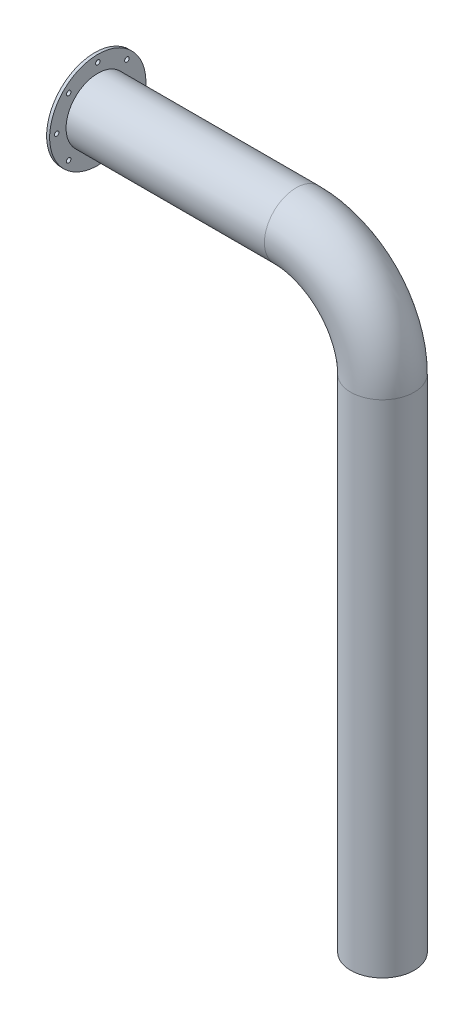
ISO-10303-21;
HEADER;
FILE_DESCRIPTION(('STEP AP214'),'2;1');
FILE_NAME('part.step','',(''),(''),'','','');
FILE_SCHEMA(('AUTOMOTIVE_DESIGN { 1 0 10303 214 1 1 1 1 }'));
ENDSEC;
DATA;
#1=APPLICATION_CONTEXT('core data for automotive mechanical design processes');
#2=APPLICATION_PROTOCOL_DEFINITION('international standard','automotive_design',2000,#1);
#3=PRODUCT_CONTEXT('',#1,'mechanical');
#4=PRODUCT('Part','Part','',(#3));
#5=PRODUCT_RELATED_PRODUCT_CATEGORY('part','',(#4));
#6=PRODUCT_DEFINITION_FORMATION('','',#4);
#7=PRODUCT_DEFINITION_CONTEXT('part definition',#1,'design');
#8=PRODUCT_DEFINITION('design','',#6,#7);
#9=PRODUCT_DEFINITION_SHAPE('','',#8);
#10=(LENGTH_UNIT() NAMED_UNIT(*) SI_UNIT(.MILLI.,.METRE.));
#11=(NAMED_UNIT(*) PLANE_ANGLE_UNIT() SI_UNIT($,.RADIAN.));
#12=(NAMED_UNIT(*) SI_UNIT($,.STERADIAN.) SOLID_ANGLE_UNIT());
#13=UNCERTAINTY_MEASURE_WITH_UNIT(LENGTH_MEASURE(1.E-05),#10,'distance_accuracy_value','');
#14=(GEOMETRIC_REPRESENTATION_CONTEXT(3) GLOBAL_UNCERTAINTY_ASSIGNED_CONTEXT((#13)) GLOBAL_UNIT_ASSIGNED_CONTEXT((#10,
#11,#12)) REPRESENTATION_CONTEXT('',''));
#15=CARTESIAN_POINT('',(0.,0.,0.));
#16=DIRECTION('',(0.,0.,1.));
#17=DIRECTION('',(1.,0.,0.));
#18=AXIS2_PLACEMENT_3D('',#15,#16,#17);
#19=CARTESIAN_POINT('',(8.,0.,0.));
#20=DIRECTION('',(1.,0.,0.));
#21=DIRECTION('',(0.,0.,-1.));
#22=AXIS2_PLACEMENT_3D('',#19,#20,#21);
#23=PLANE('',#22);
#24=CARTESIAN_POINT('',(8.,77.0746391493271,77.074639149331));
#25=DIRECTION('',(1.,0.,0.));
#26=DIRECTION('',(0.,0.,-1.));
#27=AXIS2_PLACEMENT_3D('',#24,#25,#26);
#28=CIRCLE('',#27,6.0000000000058);
#29=CARTESIAN_POINT('',(8.,77.0746391493271,71.0746391493252));
#30=VERTEX_POINT('',#29);
#31=EDGE_CURVE('E88',#30,#30,#28,.T.);
#32=ORIENTED_EDGE('',*,*,#31,.F.);
#33=EDGE_LOOP('',(#32));
#34=FACE_BOUND('',#33,.T.);
#35=CARTESIAN_POINT('',(8.,-77.0746391493402,77.0746391493178));
#36=DIRECTION('',(1.,0.,0.));
#37=DIRECTION('',(0.,0.,-1.));
#38=AXIS2_PLACEMENT_3D('',#35,#36,#37);
#39=CIRCLE('',#38,6.000000000018);
#40=CARTESIAN_POINT('',(8.,-77.0746391493402,71.0746391492998));
#41=VERTEX_POINT('',#40);
#42=EDGE_CURVE('E76',#41,#41,#39,.T.);
#43=ORIENTED_EDGE('',*,*,#42,.F.);
#44=EDGE_LOOP('',(#43));
#45=FACE_BOUND('',#44,.T.);
#46=CARTESIAN_POINT('',(8.,-77.0746391493271,-77.0746391493495));
#47=DIRECTION('',(1.,0.,0.));
#48=DIRECTION('',(0.,0.,-1.));
#49=AXIS2_PLACEMENT_3D('',#46,#47,#48);
#50=CIRCLE('',#49,6.00000000001378);
#51=CARTESIAN_POINT('',(8.,-77.0746391493271,-83.0746391493633));
#52=VERTEX_POINT('',#51);
#53=EDGE_CURVE('E64',#52,#52,#50,.T.);
#54=ORIENTED_EDGE('',*,*,#53,.F.);
#55=EDGE_LOOP('',(#54));
#56=FACE_BOUND('',#55,.T.);
#57=CARTESIAN_POINT('',(8.,77.0746391493402,-77.0746391493364));
#58=DIRECTION('',(1.,0.,0.));
#59=DIRECTION('',(0.,0.,-1.));
#60=AXIS2_PLACEMENT_3D('',#57,#58,#59);
#61=CIRCLE('',#60,6.00000000000088);
#62=CARTESIAN_POINT('',(8.,77.0746391493402,-83.0746391493373));
#63=VERTEX_POINT('',#62);
#64=EDGE_CURVE('E52',#63,#63,#61,.T.);
#65=ORIENTED_EDGE('',*,*,#64,.F.);
#66=EDGE_LOOP('',(#65));
#67=FACE_BOUND('',#66,.T.);
#68=CARTESIAN_POINT('',(8.,0.,0.));
#69=DIRECTION('',(1.,0.,0.));
#70=DIRECTION('',(0.,0.,-1.));
#71=AXIS2_PLACEMENT_3D('',#68,#69,#70);
#72=CIRCLE('',#71,127.5);
#73=CARTESIAN_POINT('',(8.,0.,-127.5));
#74=VERTEX_POINT('',#73);
#75=EDGE_CURVE('E10',#74,#74,#72,.T.);
#76=ORIENTED_EDGE('',*,*,#75,.T.);
#77=EDGE_LOOP('',(#76));
#78=FACE_BOUND('',#77,.T.);
#79=CARTESIAN_POINT('',(8.,109.,0.));
#80=DIRECTION('',(1.,0.,0.));
#81=DIRECTION('',(0.,0.,-1.));
#82=AXIS2_PLACEMENT_3D('',#79,#80,#81);
#83=CIRCLE('',#82,6.);
#84=CARTESIAN_POINT('',(8.,109.,-6.));
#85=VERTEX_POINT('',#84);
#86=EDGE_CURVE('E48',#85,#85,#83,.T.);
#87=ORIENTED_EDGE('',*,*,#86,.F.);
#88=EDGE_LOOP('',(#87));
#89=FACE_BOUND('',#88,.T.);
#90=CARTESIAN_POINT('',(8.,9.27387600857605E-12,-109.000000000009));
#91=DIRECTION('',(1.,0.,0.));
#92=DIRECTION('',(0.,0.,-1.));
#93=AXIS2_PLACEMENT_3D('',#90,#91,#92);
#94=CIRCLE('',#93,6.00000000000653);
#95=CARTESIAN_POINT('',(8.,9.27387600857605E-12,-115.000000000016));
#96=VERTEX_POINT('',#95);
#97=EDGE_CURVE('E58',#96,#96,#94,.T.);
#98=ORIENTED_EDGE('',*,*,#97,.F.);
#99=EDGE_LOOP('',(#98));
#100=FACE_BOUND('',#99,.T.);
#101=CARTESIAN_POINT('',(8.,-109.,-1.85477520171521E-11));
#102=DIRECTION('',(1.,0.,0.));
#103=DIRECTION('',(0.,0.,-1.));
#104=AXIS2_PLACEMENT_3D('',#101,#102,#103);
#105=CIRCLE('',#104,6.00000000001847);
#106=CARTESIAN_POINT('',(8.,-109.,-6.00000000003701));
#107=VERTEX_POINT('',#106);
#108=EDGE_CURVE('E70',#107,#107,#105,.T.);
#109=ORIENTED_EDGE('',*,*,#108,.F.);
#110=EDGE_LOOP('',(#109));
#111=FACE_BOUND('',#110,.T.);
#112=CARTESIAN_POINT('',(8.,-9.28722465868676E-12,108.999999999991));
#113=DIRECTION('',(1.,0.,0.));
#114=DIRECTION('',(0.,0.,-1.));
#115=AXIS2_PLACEMENT_3D('',#112,#113,#114);
#116=CIRCLE('',#115,6.00000000001268);
#117=CARTESIAN_POINT('',(8.,-9.28722465868676E-12,102.999999999978));
#118=VERTEX_POINT('',#117);
#119=EDGE_CURVE('E82',#118,#118,#116,.T.);
#120=ORIENTED_EDGE('',*,*,#119,.F.);
#121=EDGE_LOOP('',(#120));
#122=FACE_BOUND('',#121,.T.);
#123=CARTESIAN_POINT('',(8.,0.,0.));
#124=DIRECTION('',(1.,0.,0.));
#125=DIRECTION('',(0.,0.,-1.));
#126=AXIS2_PLACEMENT_3D('',#123,#124,#125);
#127=CIRCLE('',#126,84.);
#128=CARTESIAN_POINT('',(8.,0.,-84.));
#129=VERTEX_POINT('',#128);
#130=EDGE_CURVE('E97',#129,#129,#127,.T.);
#131=ORIENTED_EDGE('',*,*,#130,.F.);
#132=EDGE_LOOP('',(#131));
#133=FACE_BOUND('',#132,.T.);
#134=ADVANCED_FACE('F33',(#34,#45,#56,#67,#78,#89,#100,#111,#122,#133),#23,.T.);
#135=CARTESIAN_POINT('',(0.,0.,0.));
#136=DIRECTION('',(1.,0.,0.));
#137=DIRECTION('',(0.,0.,-1.));
#138=AXIS2_PLACEMENT_3D('',#135,#136,#137);
#139=PLANE('',#138);
#140=CARTESIAN_POINT('',(0.,0.,0.));
#141=DIRECTION('',(1.,0.,0.));
#142=DIRECTION('',(0.,0.,-1.));
#143=AXIS2_PLACEMENT_3D('',#140,#141,#142);
#144=CIRCLE('',#143,127.5);
#145=CARTESIAN_POINT('',(0.,0.,-127.5));
#146=VERTEX_POINT('',#145);
#147=EDGE_CURVE('E37',#146,#146,#144,.T.);
#148=ORIENTED_EDGE('',*,*,#147,.F.);
#149=EDGE_LOOP('',(#148));
#150=FACE_BOUND('',#149,.T.);
#151=CARTESIAN_POINT('',(0.,0.,0.));
#152=DIRECTION('',(1.,0.,0.));
#153=DIRECTION('',(0.,0.,-1.));
#154=AXIS2_PLACEMENT_3D('',#151,#152,#153);
#155=CIRCLE('',#154,80.);
#156=CARTESIAN_POINT('',(0.,0.,-80.));
#157=VERTEX_POINT('',#156);
#158=EDGE_CURVE('E44',#157,#157,#155,.T.);
#159=ORIENTED_EDGE('',*,*,#158,.T.);
#160=EDGE_LOOP('',(#159));
#161=FACE_BOUND('',#160,.T.);
#162=CARTESIAN_POINT('',(0.,109.,0.));
#163=DIRECTION('',(1.,0.,0.));
#164=DIRECTION('',(0.,0.,-1.));
#165=AXIS2_PLACEMENT_3D('',#162,#163,#164);
#166=CIRCLE('',#165,6.);
#167=CARTESIAN_POINT('',(0.,109.,-6.));
#168=VERTEX_POINT('',#167);
#169=EDGE_CURVE('E49',#168,#168,#166,.T.);
#170=ORIENTED_EDGE('',*,*,#169,.T.);
#171=EDGE_LOOP('',(#170));
#172=FACE_BOUND('',#171,.T.);
#173=CARTESIAN_POINT('',(0.,77.0746391493402,-77.0746391493364));
#174=DIRECTION('',(1.,0.,0.));
#175=DIRECTION('',(0.,0.,-1.));
#176=AXIS2_PLACEMENT_3D('',#173,#174,#175);
#177=CIRCLE('',#176,6.00000000000088);
#178=CARTESIAN_POINT('',(0.,77.0746391493402,-83.0746391493373));
#179=VERTEX_POINT('',#178);
#180=EDGE_CURVE('E55',#179,#179,#177,.T.);
#181=ORIENTED_EDGE('',*,*,#180,.T.);
#182=EDGE_LOOP('',(#181));
#183=FACE_BOUND('',#182,.T.);
#184=CARTESIAN_POINT('',(0.,9.27387600857605E-12,-109.000000000009));
#185=DIRECTION('',(1.,0.,0.));
#186=DIRECTION('',(0.,0.,-1.));
#187=AXIS2_PLACEMENT_3D('',#184,#185,#186);
#188=CIRCLE('',#187,6.00000000000653);
#189=CARTESIAN_POINT('',(0.,9.27387600857605E-12,-115.000000000016));
#190=VERTEX_POINT('',#189);
#191=EDGE_CURVE('E61',#190,#190,#188,.T.);
#192=ORIENTED_EDGE('',*,*,#191,.T.);
#193=EDGE_LOOP('',(#192));
#194=FACE_BOUND('',#193,.T.);
#195=CARTESIAN_POINT('',(0.,-77.0746391493271,-77.0746391493495));
#196=DIRECTION('',(1.,0.,0.));
#197=DIRECTION('',(0.,0.,-1.));
#198=AXIS2_PLACEMENT_3D('',#195,#196,#197);
#199=CIRCLE('',#198,6.00000000001378);
#200=CARTESIAN_POINT('',(0.,-77.0746391493271,-83.0746391493633));
#201=VERTEX_POINT('',#200);
#202=EDGE_CURVE('E67',#201,#201,#199,.T.);
#203=ORIENTED_EDGE('',*,*,#202,.T.);
#204=EDGE_LOOP('',(#203));
#205=FACE_BOUND('',#204,.T.);
#206=CARTESIAN_POINT('',(0.,-109.,-1.85477520171521E-11));
#207=DIRECTION('',(1.,0.,0.));
#208=DIRECTION('',(0.,0.,-1.));
#209=AXIS2_PLACEMENT_3D('',#206,#207,#208);
#210=CIRCLE('',#209,6.00000000001847);
#211=CARTESIAN_POINT('',(0.,-109.,-6.00000000003701));
#212=VERTEX_POINT('',#211);
#213=EDGE_CURVE('E73',#212,#212,#210,.T.);
#214=ORIENTED_EDGE('',*,*,#213,.T.);
#215=EDGE_LOOP('',(#214));
#216=FACE_BOUND('',#215,.T.);
#217=CARTESIAN_POINT('',(0.,-77.0746391493402,77.0746391493178));
#218=DIRECTION('',(1.,0.,0.));
#219=DIRECTION('',(0.,0.,-1.));
#220=AXIS2_PLACEMENT_3D('',#217,#218,#219);
#221=CIRCLE('',#220,6.000000000018);
#222=CARTESIAN_POINT('',(0.,-77.0746391493402,71.0746391492998));
#223=VERTEX_POINT('',#222);
#224=EDGE_CURVE('E79',#223,#223,#221,.T.);
#225=ORIENTED_EDGE('',*,*,#224,.T.);
#226=EDGE_LOOP('',(#225));
#227=FACE_BOUND('',#226,.T.);
#228=CARTESIAN_POINT('',(0.,-9.28722465868676E-12,108.999999999991));
#229=DIRECTION('',(1.,0.,0.));
#230=DIRECTION('',(0.,0.,-1.));
#231=AXIS2_PLACEMENT_3D('',#228,#229,#230);
#232=CIRCLE('',#231,6.00000000001268);
#233=CARTESIAN_POINT('',(0.,-9.28722465868676E-12,102.999999999978));
#234=VERTEX_POINT('',#233);
#235=EDGE_CURVE('E85',#234,#234,#232,.T.);
#236=ORIENTED_EDGE('',*,*,#235,.T.);
#237=EDGE_LOOP('',(#236));
#238=FACE_BOUND('',#237,.T.);
#239=CARTESIAN_POINT('',(0.,77.0746391493271,77.074639149331));
#240=DIRECTION('',(1.,0.,0.));
#241=DIRECTION('',(0.,0.,-1.));
#242=AXIS2_PLACEMENT_3D('',#239,#240,#241);
#243=CIRCLE('',#242,6.0000000000058);
#244=CARTESIAN_POINT('',(0.,77.0746391493271,71.0746391493252));
#245=VERTEX_POINT('',#244);
#246=EDGE_CURVE('E91',#245,#245,#243,.T.);
#247=ORIENTED_EDGE('',*,*,#246,.T.);
#248=EDGE_LOOP('',(#247));
#249=FACE_BOUND('',#248,.T.);
#250=ADVANCED_FACE('F142',(#150,#161,#172,#183,#194,#205,#216,#227,#238,#249),#139,.F.);
#251=CARTESIAN_POINT('',(8.,0.,0.));
#252=DIRECTION('',(-1.,0.,0.));
#253=DIRECTION('',(0.,0.,1.));
#254=AXIS2_PLACEMENT_3D('',#251,#252,#253);
#255=CYLINDRICAL_SURFACE('',#254,127.5);
#256=ORIENTED_EDGE('',*,*,#75,.F.);
#257=EDGE_LOOP('',(#256));
#258=FACE_BOUND('',#257,.T.);
#259=ORIENTED_EDGE('',*,*,#147,.T.);
#260=EDGE_LOOP('',(#259));
#261=FACE_BOUND('',#260,.T.);
#262=ADVANCED_FACE('F35',(#258,#261),#255,.T.);
#263=CARTESIAN_POINT('',(8.,0.,0.));
#264=DIRECTION('',(-1.,0.,0.));
#265=DIRECTION('',(0.,0.,1.));
#266=AXIS2_PLACEMENT_3D('',#263,#264,#265);
#267=CYLINDRICAL_SURFACE('',#266,80.);
#268=ORIENTED_EDGE('',*,*,#158,.F.);
#269=EDGE_LOOP('',(#268));
#270=FACE_BOUND('',#269,.T.);
#271=CARTESIAN_POINT('',(533.2,0.,0.));
#272=DIRECTION('',(1.,0.,0.));
#273=DIRECTION('',(0.,0.,-1.));
#274=AXIS2_PLACEMENT_3D('',#271,#272,#273);
#275=CIRCLE('',#274,80.);
#276=CARTESIAN_POINT('',(533.2,80.,0.));
#277=VERTEX_POINT('',#276);
#278=EDGE_CURVE('E106',#277,#277,#275,.F.);
#279=ORIENTED_EDGE('',*,*,#278,.F.);
#280=EDGE_LOOP('',(#279));
#281=FACE_BOUND('',#280,.T.);
#282=ADVANCED_FACE('F152',(#270,#281),#267,.F.);
#283=CARTESIAN_POINT('',(8.,109.,0.));
#284=DIRECTION('',(-1.,0.,0.));
#285=DIRECTION('',(0.,0.,1.));
#286=AXIS2_PLACEMENT_3D('',#283,#284,#285);
#287=CYLINDRICAL_SURFACE('',#286,6.);
#288=ORIENTED_EDGE('',*,*,#86,.T.);
#289=EDGE_LOOP('',(#288));
#290=FACE_BOUND('',#289,.T.);
#291=ORIENTED_EDGE('',*,*,#169,.F.);
#292=EDGE_LOOP('',(#291));
#293=FACE_BOUND('',#292,.T.);
#294=ADVANCED_FACE('F155',(#290,#293),#287,.F.);
#295=CARTESIAN_POINT('',(8.,77.0746391493402,-77.0746391493364));
#296=DIRECTION('',(-1.,0.,0.));
#297=DIRECTION('',(0.,0.,1.));
#298=AXIS2_PLACEMENT_3D('',#295,#296,#297);
#299=CYLINDRICAL_SURFACE('',#298,6.00000000000088);
#300=ORIENTED_EDGE('',*,*,#64,.T.);
#301=EDGE_LOOP('',(#300));
#302=FACE_BOUND('',#301,.T.);
#303=ORIENTED_EDGE('',*,*,#180,.F.);
#304=EDGE_LOOP('',(#303));
#305=FACE_BOUND('',#304,.T.);
#306=ADVANCED_FACE('F159',(#302,#305),#299,.F.);
#307=CARTESIAN_POINT('',(8.,9.27387600857605E-12,-109.000000000009));
#308=DIRECTION('',(-1.,0.,0.));
#309=DIRECTION('',(0.,0.,1.));
#310=AXIS2_PLACEMENT_3D('',#307,#308,#309);
#311=CYLINDRICAL_SURFACE('',#310,6.00000000000653);
#312=ORIENTED_EDGE('',*,*,#97,.T.);
#313=EDGE_LOOP('',(#312));
#314=FACE_BOUND('',#313,.T.);
#315=ORIENTED_EDGE('',*,*,#191,.F.);
#316=EDGE_LOOP('',(#315));
#317=FACE_BOUND('',#316,.T.);
#318=ADVANCED_FACE('F163',(#314,#317),#311,.F.);
#319=CARTESIAN_POINT('',(8.,-77.0746391493271,-77.0746391493495));
#320=DIRECTION('',(-1.,0.,0.));
#321=DIRECTION('',(0.,0.,1.));
#322=AXIS2_PLACEMENT_3D('',#319,#320,#321);
#323=CYLINDRICAL_SURFACE('',#322,6.00000000001378);
#324=ORIENTED_EDGE('',*,*,#53,.T.);
#325=EDGE_LOOP('',(#324));
#326=FACE_BOUND('',#325,.T.);
#327=ORIENTED_EDGE('',*,*,#202,.F.);
#328=EDGE_LOOP('',(#327));
#329=FACE_BOUND('',#328,.T.);
#330=ADVANCED_FACE('F167',(#326,#329),#323,.F.);
#331=CARTESIAN_POINT('',(8.,-109.,-1.85477520171521E-11));
#332=DIRECTION('',(-1.,0.,0.));
#333=DIRECTION('',(0.,0.,1.));
#334=AXIS2_PLACEMENT_3D('',#331,#332,#333);
#335=CYLINDRICAL_SURFACE('',#334,6.00000000001847);
#336=ORIENTED_EDGE('',*,*,#108,.T.);
#337=EDGE_LOOP('',(#336));
#338=FACE_BOUND('',#337,.T.);
#339=ORIENTED_EDGE('',*,*,#213,.F.);
#340=EDGE_LOOP('',(#339));
#341=FACE_BOUND('',#340,.T.);
#342=ADVANCED_FACE('F171',(#338,#341),#335,.F.);
#343=CARTESIAN_POINT('',(8.,-77.0746391493402,77.0746391493178));
#344=DIRECTION('',(-1.,0.,0.));
#345=DIRECTION('',(0.,0.,1.));
#346=AXIS2_PLACEMENT_3D('',#343,#344,#345);
#347=CYLINDRICAL_SURFACE('',#346,6.000000000018);
#348=ORIENTED_EDGE('',*,*,#42,.T.);
#349=EDGE_LOOP('',(#348));
#350=FACE_BOUND('',#349,.T.);
#351=ORIENTED_EDGE('',*,*,#224,.F.);
#352=EDGE_LOOP('',(#351));
#353=FACE_BOUND('',#352,.T.);
#354=ADVANCED_FACE('F175',(#350,#353),#347,.F.);
#355=CARTESIAN_POINT('',(8.,-9.28722465868676E-12,108.999999999991));
#356=DIRECTION('',(-1.,0.,0.));
#357=DIRECTION('',(0.,0.,1.));
#358=AXIS2_PLACEMENT_3D('',#355,#356,#357);
#359=CYLINDRICAL_SURFACE('',#358,6.00000000001268);
#360=ORIENTED_EDGE('',*,*,#119,.T.);
#361=EDGE_LOOP('',(#360));
#362=FACE_BOUND('',#361,.T.);
#363=ORIENTED_EDGE('',*,*,#235,.F.);
#364=EDGE_LOOP('',(#363));
#365=FACE_BOUND('',#364,.T.);
#366=ADVANCED_FACE('F179',(#362,#365),#359,.F.);
#367=CARTESIAN_POINT('',(8.,77.0746391493271,77.074639149331));
#368=DIRECTION('',(-1.,0.,0.));
#369=DIRECTION('',(0.,0.,1.));
#370=AXIS2_PLACEMENT_3D('',#367,#368,#369);
#371=CYLINDRICAL_SURFACE('',#370,6.0000000000058);
#372=ORIENTED_EDGE('',*,*,#31,.T.);
#373=EDGE_LOOP('',(#372));
#374=FACE_BOUND('',#373,.T.);
#375=ORIENTED_EDGE('',*,*,#246,.F.);
#376=EDGE_LOOP('',(#375));
#377=FACE_BOUND('',#376,.T.);
#378=ADVANCED_FACE('F183',(#374,#377),#371,.F.);
#379=CARTESIAN_POINT('',(533.2,0.,0.));
#380=DIRECTION('',(-1.,0.,0.));
#381=DIRECTION('',(0.,0.,1.));
#382=AXIS2_PLACEMENT_3D('',#379,#380,#381);
#383=CYLINDRICAL_SURFACE('',#382,84.);
#384=CARTESIAN_POINT('',(533.2,0.,0.));
#385=DIRECTION('',(1.,0.,0.));
#386=DIRECTION('',(0.,0.,-1.));
#387=AXIS2_PLACEMENT_3D('',#384,#385,#386);
#388=CIRCLE('',#387,84.);
#389=CARTESIAN_POINT('',(533.2,84.,0.));
#390=VERTEX_POINT('',#389);
#391=EDGE_CURVE('E94',#390,#390,#388,.T.);
#392=ORIENTED_EDGE('',*,*,#391,.F.);
#393=EDGE_LOOP('',(#392));
#394=FACE_BOUND('',#393,.T.);
#395=ORIENTED_EDGE('',*,*,#130,.T.);
#396=EDGE_LOOP('',(#395));
#397=FACE_BOUND('',#396,.T.);
#398=ADVANCED_FACE('F136',(#394,#397),#383,.T.);
#399=CARTESIAN_POINT('',(533.2,-228.6,0.));
#400=DIRECTION('',(0.,0.,-1.));
#401=DIRECTION('',(-1.,0.,0.));
#402=AXIS2_PLACEMENT_3D('',#399,#400,#401);
#403=TOROIDAL_SURFACE('',#402,228.6,84.);
#404=CARTESIAN_POINT('',(761.8,-228.6,0.));
#405=DIRECTION('',(0.,-1.,0.));
#406=DIRECTION('',(0.,0.,-1.));
#407=AXIS2_PLACEMENT_3D('',#404,#405,#406);
#408=CIRCLE('',#407,84.);
#409=CARTESIAN_POINT('',(845.8,-228.6,0.));
#410=VERTEX_POINT('',#409);
#411=EDGE_CURVE('E103',#410,#410,#408,.T.);
#412=CARTESIAN_POINT('',(533.2,-228.6,0.));
#413=DIRECTION('',(0.,0.,-1.));
#414=DIRECTION('',(-1.,0.,0.));
#415=AXIS2_PLACEMENT_3D('',#412,#413,#414);
#416=CIRCLE('',#415,312.6);
#417=EDGE_CURVE('',#390,#410,#416,.T.);
#418=ORIENTED_EDGE('',*,*,#391,.T.);
#419=ORIENTED_EDGE('',*,*,#411,.F.);
#420=ORIENTED_EDGE('',*,*,#417,.T.);
#421=ORIENTED_EDGE('',*,*,#417,.F.);
#422=EDGE_LOOP('',(#418,#420,#419,#421));
#423=FACE_BOUND('',#422,.T.);
#424=ADVANCED_FACE('F127',(#423),#403,.T.);
#425=CARTESIAN_POINT('',(533.2,-228.6,0.));
#426=DIRECTION('',(0.,0.,-1.));
#427=DIRECTION('',(-1.,0.,0.));
#428=AXIS2_PLACEMENT_3D('',#425,#426,#427);
#429=TOROIDAL_SURFACE('',#428,228.6,80.);
#430=CARTESIAN_POINT('',(761.8,-228.6,0.));
#431=DIRECTION('',(0.,-1.,0.));
#432=DIRECTION('',(0.,0.,-1.));
#433=AXIS2_PLACEMENT_3D('',#430,#431,#432);
#434=CIRCLE('',#433,80.);
#435=CARTESIAN_POINT('',(841.8,-228.6,0.));
#436=VERTEX_POINT('',#435);
#437=EDGE_CURVE('E100',#436,#436,#434,.F.);
#438=CARTESIAN_POINT('',(533.2,-228.6,0.));
#439=DIRECTION('',(0.,0.,-1.));
#440=DIRECTION('',(-1.,0.,0.));
#441=AXIS2_PLACEMENT_3D('',#438,#439,#440);
#442=CIRCLE('',#441,308.6);
#443=EDGE_CURVE('',#277,#436,#442,.T.);
#444=ORIENTED_EDGE('',*,*,#278,.T.);
#445=ORIENTED_EDGE('',*,*,#437,.F.);
#446=ORIENTED_EDGE('',*,*,#443,.T.);
#447=ORIENTED_EDGE('',*,*,#443,.F.);
#448=EDGE_LOOP('',(#444,#446,#445,#447));
#449=FACE_BOUND('',#448,.T.);
#450=ADVANCED_FACE('F124',(#449),#429,.F.);
#451=CARTESIAN_POINT('',(761.8,-1554.5,0.));
#452=DIRECTION('',(0.,-1.,0.));
#453=DIRECTION('',(1.,0.,0.));
#454=AXIS2_PLACEMENT_3D('',#451,#452,#453);
#455=PLANE('',#454);
#456=CARTESIAN_POINT('',(761.8,-1554.5,0.));
#457=DIRECTION('',(0.,-1.,0.));
#458=DIRECTION('',(1.,0.,0.));
#459=AXIS2_PLACEMENT_3D('',#456,#457,#458);
#460=CIRCLE('',#459,83.9999999999999);
#461=CARTESIAN_POINT('',(845.8,-1554.5,0.));
#462=VERTEX_POINT('',#461);
#463=EDGE_CURVE('E107',#462,#462,#460,.T.);
#464=ORIENTED_EDGE('',*,*,#463,.T.);
#465=EDGE_LOOP('',(#464));
#466=FACE_BOUND('',#465,.T.);
#467=CARTESIAN_POINT('',(761.8,-1554.5,0.));
#468=DIRECTION('',(0.,-1.,0.));
#469=DIRECTION('',(1.,0.,0.));
#470=AXIS2_PLACEMENT_3D('',#467,#468,#469);
#471=CIRCLE('',#470,80.);
#472=CARTESIAN_POINT('',(841.8,-1554.5,0.));
#473=VERTEX_POINT('',#472);
#474=EDGE_CURVE('E114',#473,#473,#471,.T.);
#475=ORIENTED_EDGE('',*,*,#474,.F.);
#476=EDGE_LOOP('',(#475));
#477=FACE_BOUND('',#476,.T.);
#478=ADVANCED_FACE('F121',(#466,#477),#455,.T.);
#479=CARTESIAN_POINT('',(761.8,-1554.5,0.));
#480=DIRECTION('',(0.,1.,0.));
#481=DIRECTION('',(-1.,0.,0.));
#482=AXIS2_PLACEMENT_3D('',#479,#480,#481);
#483=CYLINDRICAL_SURFACE('',#482,83.9999999999999);
#484=ORIENTED_EDGE('',*,*,#463,.F.);
#485=EDGE_LOOP('',(#484));
#486=FACE_BOUND('',#485,.T.);
#487=ORIENTED_EDGE('',*,*,#411,.T.);
#488=EDGE_LOOP('',(#487));
#489=FACE_BOUND('',#488,.T.);
#490=ADVANCED_FACE('F123',(#486,#489),#483,.T.);
#491=CARTESIAN_POINT('',(761.8,-1554.5,0.));
#492=DIRECTION('',(0.,1.,0.));
#493=DIRECTION('',(-1.,0.,0.));
#494=AXIS2_PLACEMENT_3D('',#491,#492,#493);
#495=CYLINDRICAL_SURFACE('',#494,80.);
#496=ORIENTED_EDGE('',*,*,#474,.T.);
#497=EDGE_LOOP('',(#496));
#498=FACE_BOUND('',#497,.T.);
#499=ORIENTED_EDGE('',*,*,#437,.T.);
#500=EDGE_LOOP('',(#499));
#501=FACE_BOUND('',#500,.T.);
#502=ADVANCED_FACE('F118',(#498,#501),#495,.F.);
#503=CLOSED_SHELL('',(#134,#250,#262,#282,#294,#306,#318,#330,#342,#354,#366,#378,#398,#424,
#450,#478,#490,#502));
#504=MANIFOLD_SOLID_BREP('B2',#503);
#505=ADVANCED_BREP_SHAPE_REPRESENTATION('',(#18,#504),#14);
#506=SHAPE_DEFINITION_REPRESENTATION(#9,#505);
ENDSEC;
END-ISO-10303-21;
